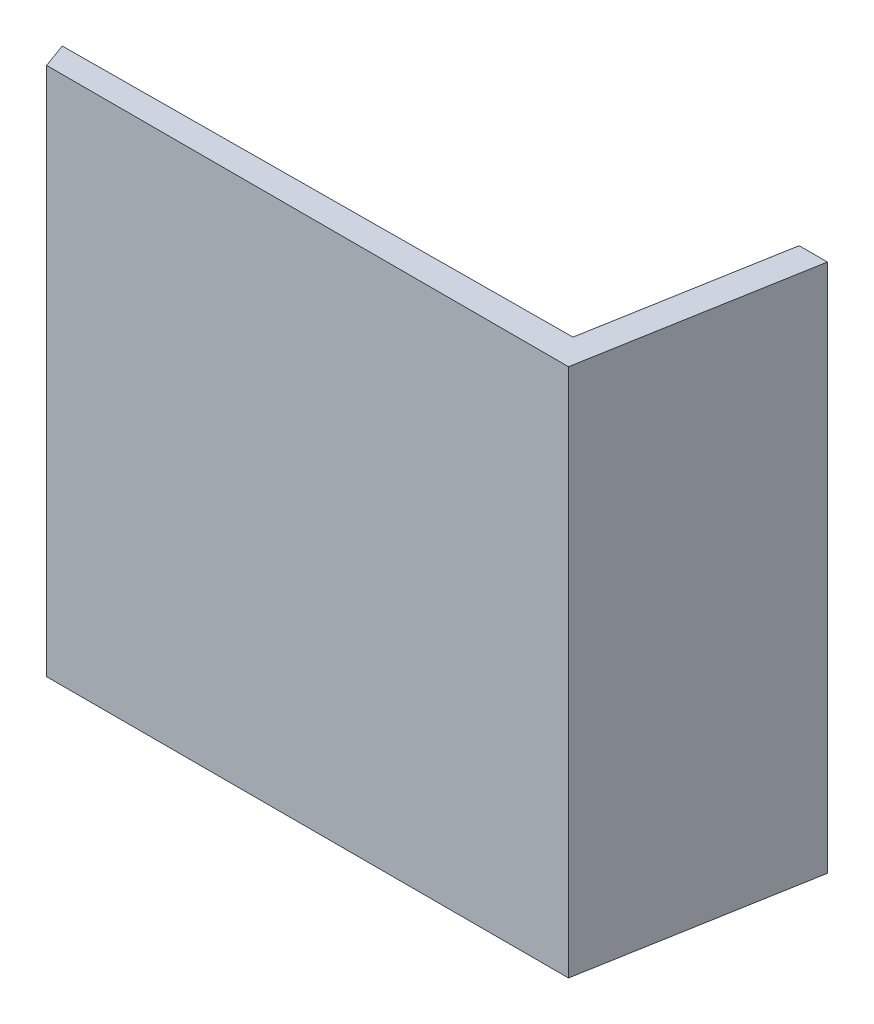
ISO-10303-21;
HEADER;
FILE_DESCRIPTION(('STEP AP214'),'2;1');
FILE_NAME('part.step','',(''),(''),'','','');
FILE_SCHEMA(('AUTOMOTIVE_DESIGN { 1 0 10303 214 1 1 1 1 }'));
ENDSEC;
DATA;
#1=APPLICATION_CONTEXT('core data for automotive mechanical design processes');
#2=APPLICATION_PROTOCOL_DEFINITION('international standard','automotive_design',2000,#1);
#3=PRODUCT_CONTEXT('',#1,'mechanical');
#4=PRODUCT('Part','Part','',(#3));
#5=PRODUCT_RELATED_PRODUCT_CATEGORY('part','',(#4));
#6=PRODUCT_DEFINITION_FORMATION('','',#4);
#7=PRODUCT_DEFINITION_CONTEXT('part definition',#1,'design');
#8=PRODUCT_DEFINITION('design','',#6,#7);
#9=PRODUCT_DEFINITION_SHAPE('','',#8);
#10=(LENGTH_UNIT() NAMED_UNIT(*) SI_UNIT(.MILLI.,.METRE.));
#11=(NAMED_UNIT(*) PLANE_ANGLE_UNIT() SI_UNIT($,.RADIAN.));
#12=(NAMED_UNIT(*) SI_UNIT($,.STERADIAN.) SOLID_ANGLE_UNIT());
#13=UNCERTAINTY_MEASURE_WITH_UNIT(LENGTH_MEASURE(1.E-05),#10,'distance_accuracy_value','');
#14=(GEOMETRIC_REPRESENTATION_CONTEXT(3) GLOBAL_UNCERTAINTY_ASSIGNED_CONTEXT((#13)) GLOBAL_UNIT_ASSIGNED_CONTEXT((#10,
#11,#12)) REPRESENTATION_CONTEXT('',''));
#15=CARTESIAN_POINT('',(0.,0.,0.));
#16=DIRECTION('',(0.,0.,1.));
#17=DIRECTION('',(1.,0.,0.));
#18=AXIS2_PLACEMENT_3D('',#15,#16,#17);
#19=CARTESIAN_POINT('',(72.4910535791554,95.,-52.5));
#20=DIRECTION('',(0.,0.,1.));
#21=DIRECTION('',(1.,0.,0.));
#22=AXIS2_PLACEMENT_3D('',#19,#20,#21);
#23=PLANE('',#22);
#24=DIRECTION('',(-1.,0.,0.));
#25=VECTOR('',#24,1.);
#26=CARTESIAN_POINT('',(72.4910535791554,0.,-52.5));
#27=LINE('',#26,#25);
#28=CARTESIAN_POINT('',(72.4910535791554,0.,-52.5));
#29=VERTEX_POINT('',#28);
#30=CARTESIAN_POINT('',(67.4139205197266,0.,-52.5));
#31=VERTEX_POINT('',#30);
#32=EDGE_CURVE('E134',#29,#31,#27,.T.);
#33=ORIENTED_EDGE('',*,*,#32,.T.);
#34=DIRECTION('',(0.,-1.,0.));
#35=VECTOR('',#34,1.);
#36=CARTESIAN_POINT('',(67.4139205197266,95.,-52.5));
#37=LINE('',#36,#35);
#38=CARTESIAN_POINT('',(67.4139205197266,95.,-52.5));
#39=VERTEX_POINT('',#38);
#40=EDGE_CURVE('E11',#39,#31,#37,.T.);
#41=ORIENTED_EDGE('',*,*,#40,.F.);
#42=DIRECTION('',(-1.,0.,0.));
#43=VECTOR('',#42,1.);
#44=CARTESIAN_POINT('',(72.4910535791554,95.,-52.5));
#45=LINE('',#44,#43);
#46=CARTESIAN_POINT('',(72.4910535791554,95.,-52.5));
#47=VERTEX_POINT('',#46);
#48=EDGE_CURVE('E150',#47,#39,#45,.T.);
#49=ORIENTED_EDGE('',*,*,#48,.F.);
#50=DIRECTION('',(0.,-1.,0.));
#51=VECTOR('',#50,1.);
#52=CARTESIAN_POINT('',(72.4910535791554,95.,-52.5));
#53=LINE('',#52,#51);
#54=EDGE_CURVE('E130',#47,#29,#53,.T.);
#55=ORIENTED_EDGE('',*,*,#54,.T.);
#56=EDGE_LOOP('',(#33,#41,#49,#55));
#57=FACE_BOUND('',#56,.T.);
#58=ADVANCED_FACE('F45',(#57),#23,.F.);
#59=CARTESIAN_POINT('',(61.3306396852845,95.,-18.));
#60=DIRECTION('',(0.984807753012207,0.,0.173648177666934));
#61=DIRECTION('',(0.173648177666934,0.,-0.984807753012208));
#62=AXIS2_PLACEMENT_3D('',#59,#60,#61);
#63=PLANE('',#62);
#64=DIRECTION('',(-0.173648177666934,0.,0.984807753012207));
#65=VECTOR('',#64,1.);
#66=CARTESIAN_POINT('',(61.3306396852845,0.,-18.));
#67=LINE('',#66,#65);
#68=CARTESIAN_POINT('',(61.3306396852845,0.,-18.));
#69=VERTEX_POINT('',#68);
#70=EDGE_CURVE('E138',#31,#69,#67,.T.);
#71=ORIENTED_EDGE('',*,*,#70,.T.);
#72=DIRECTION('',(0.,-1.,0.));
#73=VECTOR('',#72,1.);
#74=CARTESIAN_POINT('',(61.3306396852845,95.,-18.));
#75=LINE('',#74,#73);
#76=CARTESIAN_POINT('',(61.3306396852845,95.,-18.));
#77=VERTEX_POINT('',#76);
#78=EDGE_CURVE('E54',#77,#69,#75,.T.);
#79=ORIENTED_EDGE('',*,*,#78,.F.);
#80=DIRECTION('',(-0.173648177666934,0.,0.984807753012207));
#81=VECTOR('',#80,1.);
#82=CARTESIAN_POINT('',(61.3306396852845,95.,-18.));
#83=LINE('',#82,#81);
#84=EDGE_CURVE('E99',#39,#77,#83,.T.);
#85=ORIENTED_EDGE('',*,*,#84,.F.);
#86=ORIENTED_EDGE('',*,*,#40,.T.);
#87=EDGE_LOOP('',(#71,#79,#85,#86));
#88=FACE_BOUND('',#87,.T.);
#89=ADVANCED_FACE('F178',(#88),#63,.F.);
#90=CARTESIAN_POINT('',(-29.7390911915458,95.,-17.4151111077974));
#91=DIRECTION('',(0.00642229667655899,0.,0.999979376840042));
#92=DIRECTION('',(0.999979376840042,0.,-0.00642229667655899));
#93=AXIS2_PLACEMENT_3D('',#90,#91,#92);
#94=PLANE('',#93);
#95=DIRECTION('',(-0.999979376840042,0.,0.00642229667655899));
#96=VECTOR('',#95,1.);
#97=CARTESIAN_POINT('',(-29.7390911915458,0.,-17.4151111077974));
#98=LINE('',#97,#96);
#99=CARTESIAN_POINT('',(-29.7390911915458,0.,-17.4151111077974));
#100=VERTEX_POINT('',#99);
#101=EDGE_CURVE('E141',#69,#100,#98,.T.);
#102=ORIENTED_EDGE('',*,*,#101,.T.);
#103=DIRECTION('',(0.,-1.,0.));
#104=VECTOR('',#103,1.);
#105=CARTESIAN_POINT('',(-29.7390911915458,95.,-17.4151111077974));
#106=LINE('',#105,#104);
#107=CARTESIAN_POINT('',(-29.7390911915458,95.,-17.4151111077974));
#108=VERTEX_POINT('',#107);
#109=EDGE_CURVE('E123',#108,#100,#106,.T.);
#110=ORIENTED_EDGE('',*,*,#109,.F.);
#111=DIRECTION('',(-0.999979376840042,0.,0.00642229667655899));
#112=VECTOR('',#111,1.);
#113=CARTESIAN_POINT('',(-29.7390911915458,95.,-17.4151111077974));
#114=LINE('',#113,#112);
#115=EDGE_CURVE('E112',#77,#108,#114,.T.);
#116=ORIENTED_EDGE('',*,*,#115,.F.);
#117=ORIENTED_EDGE('',*,*,#78,.T.);
#118=EDGE_LOOP('',(#102,#110,#116,#117));
#119=FACE_BOUND('',#118,.T.);
#120=ADVANCED_FACE('F160',(#119),#94,.F.);
#121=CARTESIAN_POINT('',(-28.1321221673295,95.,-13.));
#122=DIRECTION('',(0.939692620785906,0.,-0.342020143325674));
#123=DIRECTION('',(-0.342020143325674,0.,-0.939692620785906));
#124=AXIS2_PLACEMENT_3D('',#121,#122,#123);
#125=PLANE('',#124);
#126=DIRECTION('',(0.342020143325674,0.,0.939692620785906));
#127=VECTOR('',#126,1.);
#128=CARTESIAN_POINT('',(-28.1321221673295,0.,-13.));
#129=LINE('',#128,#127);
#130=CARTESIAN_POINT('',(-28.1321221673295,0.,-13.));
#131=VERTEX_POINT('',#130);
#132=EDGE_CURVE('E121',#100,#131,#129,.T.);
#133=ORIENTED_EDGE('',*,*,#132,.T.);
#134=DIRECTION('',(0.,-1.,0.));
#135=VECTOR('',#134,1.);
#136=CARTESIAN_POINT('',(-28.1321221673295,95.,-13.));
#137=LINE('',#136,#135);
#138=CARTESIAN_POINT('',(-28.1321221673295,95.,-13.));
#139=VERTEX_POINT('',#138);
#140=EDGE_CURVE('E118',#139,#131,#137,.T.);
#141=ORIENTED_EDGE('',*,*,#140,.F.);
#142=DIRECTION('',(0.342020143325674,0.,0.939692620785906));
#143=VECTOR('',#142,1.);
#144=CARTESIAN_POINT('',(-28.1321221673295,95.,-13.));
#145=LINE('',#144,#143);
#146=EDGE_CURVE('E106',#108,#139,#145,.T.);
#147=ORIENTED_EDGE('',*,*,#146,.F.);
#148=ORIENTED_EDGE('',*,*,#109,.T.);
#149=EDGE_LOOP('',(#133,#141,#147,#148));
#150=FACE_BOUND('',#149,.T.);
#151=ADVANCED_FACE('F119',(#150),#125,.F.);
#152=CARTESIAN_POINT('',(-28.1321221673295,95.,-13.));
#153=DIRECTION('',(0.,0.,-1.));
#154=DIRECTION('',(-1.,0.,0.));
#155=AXIS2_PLACEMENT_3D('',#152,#153,#154);
#156=PLANE('',#155);
#157=DIRECTION('',(1.,0.,0.));
#158=VECTOR('',#157,1.);
#159=CARTESIAN_POINT('',(-28.1321221673295,0.,-13.));
#160=LINE('',#159,#158);
#161=CARTESIAN_POINT('',(65.5261378411708,0.,-13.));
#162=VERTEX_POINT('',#161);
#163=EDGE_CURVE('E85',#131,#162,#160,.T.);
#164=ORIENTED_EDGE('',*,*,#163,.T.);
#165=DIRECTION('',(0.,-1.,0.));
#166=VECTOR('',#165,1.);
#167=CARTESIAN_POINT('',(65.5261378411708,95.,-13.));
#168=LINE('',#167,#166);
#169=CARTESIAN_POINT('',(65.5261378411708,95.,-13.));
#170=VERTEX_POINT('',#169);
#171=EDGE_CURVE('E124',#170,#162,#168,.T.);
#172=ORIENTED_EDGE('',*,*,#171,.F.);
#173=DIRECTION('',(1.,0.,0.));
#174=VECTOR('',#173,1.);
#175=CARTESIAN_POINT('',(-28.1321221673295,95.,-13.));
#176=LINE('',#175,#174);
#177=EDGE_CURVE('E110',#139,#170,#176,.T.);
#178=ORIENTED_EDGE('',*,*,#177,.F.);
#179=ORIENTED_EDGE('',*,*,#140,.T.);
#180=EDGE_LOOP('',(#164,#172,#178,#179));
#181=FACE_BOUND('',#180,.T.);
#182=ADVANCED_FACE('F126',(#181),#156,.F.);
#183=CARTESIAN_POINT('',(65.5261378411708,95.,-13.));
#184=DIRECTION('',(-0.984807753012207,0.,-0.173648177666934));
#185=DIRECTION('',(-0.173648177666934,0.,0.984807753012207));
#186=AXIS2_PLACEMENT_3D('',#183,#184,#185);
#187=PLANE('',#186);
#188=DIRECTION('',(0.173648177666934,0.,-0.984807753012207));
#189=VECTOR('',#188,1.);
#190=CARTESIAN_POINT('',(65.5261378411708,0.,-13.));
#191=LINE('',#190,#189);
#192=EDGE_CURVE('E91',#162,#29,#191,.T.);
#193=ORIENTED_EDGE('',*,*,#192,.T.);
#194=ORIENTED_EDGE('',*,*,#54,.F.);
#195=DIRECTION('',(0.173648177666934,0.,-0.984807753012207));
#196=VECTOR('',#195,1.);
#197=CARTESIAN_POINT('',(65.5261378411708,95.,-13.));
#198=LINE('',#197,#196);
#199=EDGE_CURVE('E62',#170,#47,#198,.T.);
#200=ORIENTED_EDGE('',*,*,#199,.F.);
#201=ORIENTED_EDGE('',*,*,#171,.T.);
#202=EDGE_LOOP('',(#193,#194,#200,#201));
#203=FACE_BOUND('',#202,.T.);
#204=ADVANCED_FACE('F167',(#203),#187,.F.);
#205=CARTESIAN_POINT('',(0.,95.,0.));
#206=DIRECTION('',(0.,-1.,0.));
#207=DIRECTION('',(0.,0.,-1.));
#208=AXIS2_PLACEMENT_3D('',#205,#206,#207);
#209=PLANE('',#208);
#210=ORIENTED_EDGE('',*,*,#48,.T.);
#211=ORIENTED_EDGE('',*,*,#84,.T.);
#212=ORIENTED_EDGE('',*,*,#115,.T.);
#213=ORIENTED_EDGE('',*,*,#146,.T.);
#214=ORIENTED_EDGE('',*,*,#177,.T.);
#215=ORIENTED_EDGE('',*,*,#199,.T.);
#216=EDGE_LOOP('',(#210,#211,#212,#213,#214,#215));
#217=FACE_BOUND('',#216,.T.);
#218=ADVANCED_FACE('F108',(#217),#209,.F.);
#219=CARTESIAN_POINT('',(0.,0.,0.));
#220=DIRECTION('',(0.,-1.,0.));
#221=DIRECTION('',(0.,0.,-1.));
#222=AXIS2_PLACEMENT_3D('',#219,#220,#221);
#223=PLANE('',#222);
#224=ORIENTED_EDGE('',*,*,#32,.F.);
#225=ORIENTED_EDGE('',*,*,#192,.F.);
#226=ORIENTED_EDGE('',*,*,#163,.F.);
#227=ORIENTED_EDGE('',*,*,#132,.F.);
#228=ORIENTED_EDGE('',*,*,#101,.F.);
#229=ORIENTED_EDGE('',*,*,#70,.F.);
#230=EDGE_LOOP('',(#224,#225,#226,#227,#228,#229));
#231=FACE_BOUND('',#230,.T.);
#232=ADVANCED_FACE('F163',(#231),#223,.T.);
#233=CLOSED_SHELL('',(#58,#89,#120,#151,#182,#204,#218,#232));
#234=MANIFOLD_SOLID_BREP('B2',#233);
#235=ADVANCED_BREP_SHAPE_REPRESENTATION('',(#18,#234),#14);
#236=SHAPE_DEFINITION_REPRESENTATION(#9,#235);
ENDSEC;
END-ISO-10303-21;
